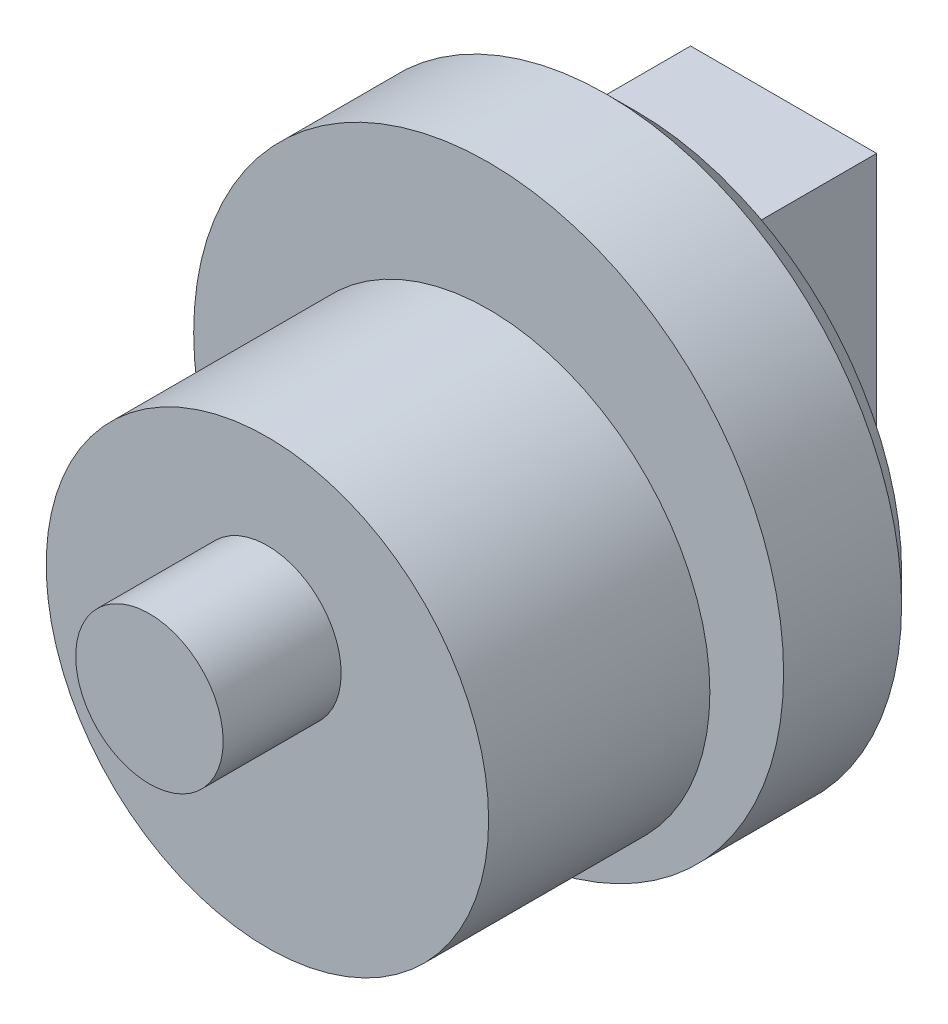
ISO-10303-21;
HEADER;
FILE_DESCRIPTION(('STEP AP214'),'2;1');
FILE_NAME('part.step','',(''),(''),'','','');
FILE_SCHEMA(('AUTOMOTIVE_DESIGN { 1 0 10303 214 1 1 1 1 }'));
ENDSEC;
DATA;
#1=APPLICATION_CONTEXT('core data for automotive mechanical design processes');
#2=APPLICATION_PROTOCOL_DEFINITION('international standard','automotive_design',2000,#1);
#3=PRODUCT_CONTEXT('',#1,'mechanical');
#4=PRODUCT('Part','Part','',(#3));
#5=PRODUCT_RELATED_PRODUCT_CATEGORY('part','',(#4));
#6=PRODUCT_DEFINITION_FORMATION('','',#4);
#7=PRODUCT_DEFINITION_CONTEXT('part definition',#1,'design');
#8=PRODUCT_DEFINITION('design','',#6,#7);
#9=PRODUCT_DEFINITION_SHAPE('','',#8);
#10=(LENGTH_UNIT() NAMED_UNIT(*) SI_UNIT(.MILLI.,.METRE.));
#11=(NAMED_UNIT(*) PLANE_ANGLE_UNIT() SI_UNIT($,.RADIAN.));
#12=(NAMED_UNIT(*) SI_UNIT($,.STERADIAN.) SOLID_ANGLE_UNIT());
#13=UNCERTAINTY_MEASURE_WITH_UNIT(LENGTH_MEASURE(1.E-05),#10,'distance_accuracy_value','');
#14=(GEOMETRIC_REPRESENTATION_CONTEXT(3) GLOBAL_UNCERTAINTY_ASSIGNED_CONTEXT((#13)) GLOBAL_UNIT_ASSIGNED_CONTEXT((#10,
#11,#12)) REPRESENTATION_CONTEXT('',''));
#15=CARTESIAN_POINT('',(0.,0.,0.));
#16=DIRECTION('',(0.,0.,1.));
#17=DIRECTION('',(1.,0.,0.));
#18=AXIS2_PLACEMENT_3D('',#15,#16,#17);
#19=CARTESIAN_POINT('',(0.,0.,0.));
#20=DIRECTION('',(0.,0.,1.));
#21=DIRECTION('',(1.,0.,0.));
#22=AXIS2_PLACEMENT_3D('',#19,#20,#21);
#23=PLANE('',#22);
#24=CARTESIAN_POINT('',(0.,0.,0.));
#25=DIRECTION('',(0.,0.,1.));
#26=DIRECTION('',(1.,0.,0.));
#27=AXIS2_PLACEMENT_3D('',#24,#25,#26);
#28=CIRCLE('',#27,9.);
#29=CARTESIAN_POINT('',(9.,0.,0.));
#30=VERTEX_POINT('',#29);
#31=EDGE_CURVE('E11',#30,#30,#28,.F.);
#32=ORIENTED_EDGE('',*,*,#31,.T.);
#33=EDGE_LOOP('',(#32));
#34=FACE_BOUND('',#33,.T.);
#35=DIRECTION('',(0.,1.,0.));
#36=VECTOR('',#35,1.);
#37=CARTESIAN_POINT('',(-3.15332491427966,6.83982655672821,0.));
#38=LINE('',#37,#36);
#39=CARTESIAN_POINT('',(-3.15332491427966,-6.83982655672821,0.));
#40=VERTEX_POINT('',#39);
#41=CARTESIAN_POINT('',(-3.15332491427966,6.83982655672821,0.));
#42=VERTEX_POINT('',#41);
#43=EDGE_CURVE('E54',#40,#42,#38,.T.);
#44=ORIENTED_EDGE('',*,*,#43,.F.);
#45=DIRECTION('',(-1.,0.,0.));
#46=VECTOR('',#45,1.);
#47=CARTESIAN_POINT('',(3.15332491427966,-6.83982655672821,0.));
#48=LINE('',#47,#46);
#49=CARTESIAN_POINT('',(3.15332491427966,-6.83982655672821,0.));
#50=VERTEX_POINT('',#49);
#51=EDGE_CURVE('E58',#50,#40,#48,.T.);
#52=ORIENTED_EDGE('',*,*,#51,.F.);
#53=DIRECTION('',(0.,-1.,0.));
#54=VECTOR('',#53,1.);
#55=CARTESIAN_POINT('',(3.15332491427966,6.83982655672821,0.));
#56=LINE('',#55,#54);
#57=CARTESIAN_POINT('',(3.15332491427966,6.83982655672821,0.));
#58=VERTEX_POINT('',#57);
#59=EDGE_CURVE('E175',#58,#50,#56,.T.);
#60=ORIENTED_EDGE('',*,*,#59,.F.);
#61=DIRECTION('',(1.,0.,0.));
#62=VECTOR('',#61,1.);
#63=CARTESIAN_POINT('',(3.15332491427966,6.83982655672821,0.));
#64=LINE('',#63,#62);
#65=EDGE_CURVE('E181',#42,#58,#64,.T.);
#66=ORIENTED_EDGE('',*,*,#65,.F.);
#67=EDGE_LOOP('',(#44,#52,#60,#66));
#68=FACE_BOUND('',#67,.T.);
#69=ADVANCED_FACE('F38',(#34,#68),#23,.F.);
#70=CARTESIAN_POINT('',(0.,0.,5.));
#71=DIRECTION('',(0.,0.,-1.));
#72=DIRECTION('',(-1.,0.,0.));
#73=AXIS2_PLACEMENT_3D('',#70,#71,#72);
#74=CYLINDRICAL_SURFACE('',#73,10.);
#75=CARTESIAN_POINT('',(0.,0.,0.999999999999999));
#76=DIRECTION('',(0.,0.,1.));
#77=DIRECTION('',(1.,0.,0.));
#78=AXIS2_PLACEMENT_3D('',#75,#76,#77);
#79=CIRCLE('',#78,10.);
#80=CARTESIAN_POINT('',(10.,0.,0.999999999999999));
#81=VERTEX_POINT('',#80);
#82=EDGE_CURVE('E47',#81,#81,#79,.T.);
#83=ORIENTED_EDGE('',*,*,#82,.T.);
#84=EDGE_LOOP('',(#83));
#85=FACE_BOUND('',#84,.T.);
#86=CARTESIAN_POINT('',(0.,0.,5.));
#87=DIRECTION('',(0.,0.,1.));
#88=DIRECTION('',(1.,0.,0.));
#89=AXIS2_PLACEMENT_3D('',#86,#87,#88);
#90=CIRCLE('',#89,10.);
#91=CARTESIAN_POINT('',(10.,0.,5.));
#92=VERTEX_POINT('',#91);
#93=EDGE_CURVE('E114',#92,#92,#90,.T.);
#94=ORIENTED_EDGE('',*,*,#93,.F.);
#95=EDGE_LOOP('',(#94));
#96=FACE_BOUND('',#95,.T.);
#97=ADVANCED_FACE('F122',(#85,#96),#74,.T.);
#98=CARTESIAN_POINT('',(0.,0.,5.));
#99=DIRECTION('',(0.,0.,1.));
#100=DIRECTION('',(1.,0.,0.));
#101=AXIS2_PLACEMENT_3D('',#98,#99,#100);
#102=PLANE('',#101);
#103=CARTESIAN_POINT('',(0.,-1.812,5.));
#104=DIRECTION('',(0.,0.,1.));
#105=DIRECTION('',(1.,0.,0.));
#106=AXIS2_PLACEMENT_3D('',#103,#104,#105);
#107=CIRCLE('',#106,7.5);
#108=CARTESIAN_POINT('',(7.5,-1.812,5.));
#109=VERTEX_POINT('',#108);
#110=EDGE_CURVE('E115',#109,#109,#107,.T.);
#111=ORIENTED_EDGE('',*,*,#110,.F.);
#112=EDGE_LOOP('',(#111));
#113=FACE_BOUND('',#112,.T.);
#114=ORIENTED_EDGE('',*,*,#93,.T.);
#115=EDGE_LOOP('',(#114));
#116=FACE_BOUND('',#115,.T.);
#117=ADVANCED_FACE('F139',(#113,#116),#102,.T.);
#118=CARTESIAN_POINT('',(0.,-1.812,12.5));
#119=DIRECTION('',(0.,0.,-1.));
#120=DIRECTION('',(-1.,0.,0.));
#121=AXIS2_PLACEMENT_3D('',#118,#119,#120);
#122=CYLINDRICAL_SURFACE('',#121,7.5);
#123=CARTESIAN_POINT('',(0.,-1.812,12.5));
#124=DIRECTION('',(0.,0.,1.));
#125=DIRECTION('',(1.,0.,0.));
#126=AXIS2_PLACEMENT_3D('',#123,#124,#125);
#127=CIRCLE('',#126,7.5);
#128=CARTESIAN_POINT('',(7.5,-1.812,12.5));
#129=VERTEX_POINT('',#128);
#130=EDGE_CURVE('E110',#129,#129,#127,.T.);
#131=ORIENTED_EDGE('',*,*,#130,.F.);
#132=EDGE_LOOP('',(#131));
#133=FACE_BOUND('',#132,.T.);
#134=ORIENTED_EDGE('',*,*,#110,.T.);
#135=EDGE_LOOP('',(#134));
#136=FACE_BOUND('',#135,.T.);
#137=ADVANCED_FACE('F143',(#133,#136),#122,.T.);
#138=CARTESIAN_POINT('',(0.,-1.812,12.5));
#139=DIRECTION('',(0.,0.,1.));
#140=DIRECTION('',(1.,0.,0.));
#141=AXIS2_PLACEMENT_3D('',#138,#139,#140);
#142=PLANE('',#141);
#143=CARTESIAN_POINT('',(0.,0.,12.5));
#144=DIRECTION('',(0.,0.,1.));
#145=DIRECTION('',(1.,0.,0.));
#146=AXIS2_PLACEMENT_3D('',#143,#144,#145);
#147=CIRCLE('',#146,2.5);
#148=CARTESIAN_POINT('',(2.5,0.,12.5));
#149=VERTEX_POINT('',#148);
#150=EDGE_CURVE('E100',#149,#149,#147,.T.);
#151=ORIENTED_EDGE('',*,*,#150,.F.);
#152=EDGE_LOOP('',(#151));
#153=FACE_BOUND('',#152,.T.);
#154=ORIENTED_EDGE('',*,*,#130,.T.);
#155=EDGE_LOOP('',(#154));
#156=FACE_BOUND('',#155,.T.);
#157=ADVANCED_FACE('F147',(#153,#156),#142,.T.);
#158=CARTESIAN_POINT('',(0.,0.,16.5));
#159=DIRECTION('',(0.,0.,-1.));
#160=DIRECTION('',(-1.,0.,0.));
#161=AXIS2_PLACEMENT_3D('',#158,#159,#160);
#162=CYLINDRICAL_SURFACE('',#161,2.5);
#163=CARTESIAN_POINT('',(0.,0.,16.5));
#164=DIRECTION('',(0.,0.,1.));
#165=DIRECTION('',(1.,0.,0.));
#166=AXIS2_PLACEMENT_3D('',#163,#164,#165);
#167=CIRCLE('',#166,2.5);
#168=CARTESIAN_POINT('',(2.5,0.,16.5));
#169=VERTEX_POINT('',#168);
#170=EDGE_CURVE('E103',#169,#169,#167,.T.);
#171=ORIENTED_EDGE('',*,*,#170,.F.);
#172=EDGE_LOOP('',(#171));
#173=FACE_BOUND('',#172,.T.);
#174=ORIENTED_EDGE('',*,*,#150,.T.);
#175=EDGE_LOOP('',(#174));
#176=FACE_BOUND('',#175,.T.);
#177=ADVANCED_FACE('F151',(#173,#176),#162,.T.);
#178=CARTESIAN_POINT('',(0.,0.,16.5));
#179=DIRECTION('',(0.,0.,1.));
#180=DIRECTION('',(1.,0.,0.));
#181=AXIS2_PLACEMENT_3D('',#178,#179,#180);
#182=PLANE('',#181);
#183=ORIENTED_EDGE('',*,*,#170,.T.);
#184=EDGE_LOOP('',(#183));
#185=FACE_BOUND('',#184,.T.);
#186=ADVANCED_FACE('F155',(#185),#182,.T.);
#187=CARTESIAN_POINT('',(-3.15332491427966,6.83982655672821,-5.));
#188=DIRECTION('',(1.,0.,0.));
#189=DIRECTION('',(0.,0.,-1.));
#190=AXIS2_PLACEMENT_3D('',#187,#188,#189);
#191=PLANE('',#190);
#192=ORIENTED_EDGE('',*,*,#43,.T.);
#193=DIRECTION('',(0.,0.,1.));
#194=VECTOR('',#193,1.);
#195=CARTESIAN_POINT('',(-3.15332491427966,6.83982655672821,-5.));
#196=LINE('',#195,#194);
#197=CARTESIAN_POINT('',(-3.15332491427966,6.83982655672821,-5.));
#198=VERTEX_POINT('',#197);
#199=EDGE_CURVE('E83',#198,#42,#196,.T.);
#200=ORIENTED_EDGE('',*,*,#199,.F.);
#201=DIRECTION('',(0.,1.,0.));
#202=VECTOR('',#201,1.);
#203=CARTESIAN_POINT('',(-3.15332491427966,6.83982655672821,-5.));
#204=LINE('',#203,#202);
#205=CARTESIAN_POINT('',(-3.15332491427966,-6.83982655672821,-5.));
#206=VERTEX_POINT('',#205);
#207=EDGE_CURVE('E89',#206,#198,#204,.T.);
#208=ORIENTED_EDGE('',*,*,#207,.F.);
#209=DIRECTION('',(0.,0.,1.));
#210=VECTOR('',#209,1.);
#211=CARTESIAN_POINT('',(-3.15332491427966,-6.83982655672821,-5.));
#212=LINE('',#211,#210);
#213=EDGE_CURVE('E173',#206,#40,#212,.T.);
#214=ORIENTED_EDGE('',*,*,#213,.T.);
#215=EDGE_LOOP('',(#192,#200,#208,#214));
#216=FACE_BOUND('',#215,.T.);
#217=ADVANCED_FACE('F99',(#216),#191,.F.);
#218=CARTESIAN_POINT('',(3.15332491427966,6.83982655672821,-5.));
#219=DIRECTION('',(0.,-1.,0.));
#220=DIRECTION('',(0.,0.,-1.));
#221=AXIS2_PLACEMENT_3D('',#218,#219,#220);
#222=PLANE('',#221);
#223=ORIENTED_EDGE('',*,*,#65,.T.);
#224=DIRECTION('',(0.,0.,1.));
#225=VECTOR('',#224,1.);
#226=CARTESIAN_POINT('',(3.15332491427966,6.83982655672821,-5.));
#227=LINE('',#226,#225);
#228=CARTESIAN_POINT('',(3.15332491427966,6.83982655672821,-5.));
#229=VERTEX_POINT('',#228);
#230=EDGE_CURVE('E85',#229,#58,#227,.T.);
#231=ORIENTED_EDGE('',*,*,#230,.F.);
#232=DIRECTION('',(1.,0.,0.));
#233=VECTOR('',#232,1.);
#234=CARTESIAN_POINT('',(3.15332491427966,6.83982655672821,-5.));
#235=LINE('',#234,#233);
#236=EDGE_CURVE('E78',#198,#229,#235,.T.);
#237=ORIENTED_EDGE('',*,*,#236,.F.);
#238=ORIENTED_EDGE('',*,*,#199,.T.);
#239=EDGE_LOOP('',(#223,#231,#237,#238));
#240=FACE_BOUND('',#239,.T.);
#241=ADVANCED_FACE('F81',(#240),#222,.F.);
#242=CARTESIAN_POINT('',(3.15332491427966,6.83982655672821,-5.));
#243=DIRECTION('',(-1.,0.,0.));
#244=DIRECTION('',(0.,0.,1.));
#245=AXIS2_PLACEMENT_3D('',#242,#243,#244);
#246=PLANE('',#245);
#247=ORIENTED_EDGE('',*,*,#59,.T.);
#248=DIRECTION('',(0.,0.,1.));
#249=VECTOR('',#248,1.);
#250=CARTESIAN_POINT('',(3.15332491427966,-6.83982655672821,-5.));
#251=LINE('',#250,#249);
#252=CARTESIAN_POINT('',(3.15332491427966,-6.83982655672821,-5.));
#253=VERTEX_POINT('',#252);
#254=EDGE_CURVE('E105',#253,#50,#251,.T.);
#255=ORIENTED_EDGE('',*,*,#254,.F.);
#256=DIRECTION('',(0.,-1.,0.));
#257=VECTOR('',#256,1.);
#258=CARTESIAN_POINT('',(3.15332491427966,6.83982655672821,-5.));
#259=LINE('',#258,#257);
#260=EDGE_CURVE('E88',#229,#253,#259,.T.);
#261=ORIENTED_EDGE('',*,*,#260,.F.);
#262=ORIENTED_EDGE('',*,*,#230,.T.);
#263=EDGE_LOOP('',(#247,#255,#261,#262));
#264=FACE_BOUND('',#263,.T.);
#265=ADVANCED_FACE('F164',(#264),#246,.F.);
#266=CARTESIAN_POINT('',(3.15332491427966,-6.83982655672821,-5.));
#267=DIRECTION('',(0.,1.,0.));
#268=DIRECTION('',(0.,0.,1.));
#269=AXIS2_PLACEMENT_3D('',#266,#267,#268);
#270=PLANE('',#269);
#271=ORIENTED_EDGE('',*,*,#51,.T.);
#272=ORIENTED_EDGE('',*,*,#213,.F.);
#273=DIRECTION('',(-1.,0.,0.));
#274=VECTOR('',#273,1.);
#275=CARTESIAN_POINT('',(3.15332491427966,-6.83982655672821,-5.));
#276=LINE('',#275,#274);
#277=EDGE_CURVE('E94',#253,#206,#276,.T.);
#278=ORIENTED_EDGE('',*,*,#277,.F.);
#279=ORIENTED_EDGE('',*,*,#254,.T.);
#280=EDGE_LOOP('',(#271,#272,#278,#279));
#281=FACE_BOUND('',#280,.T.);
#282=ADVANCED_FACE('F130',(#281),#270,.F.);
#283=CARTESIAN_POINT('',(0.,0.,-5.));
#284=DIRECTION('',(0.,0.,-1.));
#285=DIRECTION('',(-1.,0.,0.));
#286=AXIS2_PLACEMENT_3D('',#283,#284,#285);
#287=PLANE('',#286);
#288=ORIENTED_EDGE('',*,*,#207,.T.);
#289=ORIENTED_EDGE('',*,*,#236,.T.);
#290=ORIENTED_EDGE('',*,*,#260,.T.);
#291=ORIENTED_EDGE('',*,*,#277,.T.);
#292=EDGE_LOOP('',(#288,#289,#290,#291));
#293=FACE_BOUND('',#292,.T.);
#294=ADVANCED_FACE('F92',(#293),#287,.T.);
#295=CARTESIAN_POINT('',(0.,0.,0.999999999999999));
#296=DIRECTION('',(0.,0.,1.));
#297=DIRECTION('',(1.,0.,0.));
#298=AXIS2_PLACEMENT_3D('',#295,#296,#297);
#299=CONICAL_SURFACE('',#298,10.,0.78539816339745);
#300=ORIENTED_EDGE('',*,*,#31,.F.);
#301=EDGE_LOOP('',(#300));
#302=FACE_BOUND('',#301,.T.);
#303=ORIENTED_EDGE('',*,*,#82,.F.);
#304=EDGE_LOOP('',(#303));
#305=FACE_BOUND('',#304,.T.);
#306=ADVANCED_FACE('F41',(#302,#305),#299,.T.);
#307=CLOSED_SHELL('',(#69,#97,#117,#137,#157,#177,#186,#217,#241,#265,#282,#294,#306));
#308=MANIFOLD_SOLID_BREP('B2',#307);
#309=ADVANCED_BREP_SHAPE_REPRESENTATION('',(#18,#308),#14);
#310=SHAPE_DEFINITION_REPRESENTATION(#9,#309);
ENDSEC;
END-ISO-10303-21;
